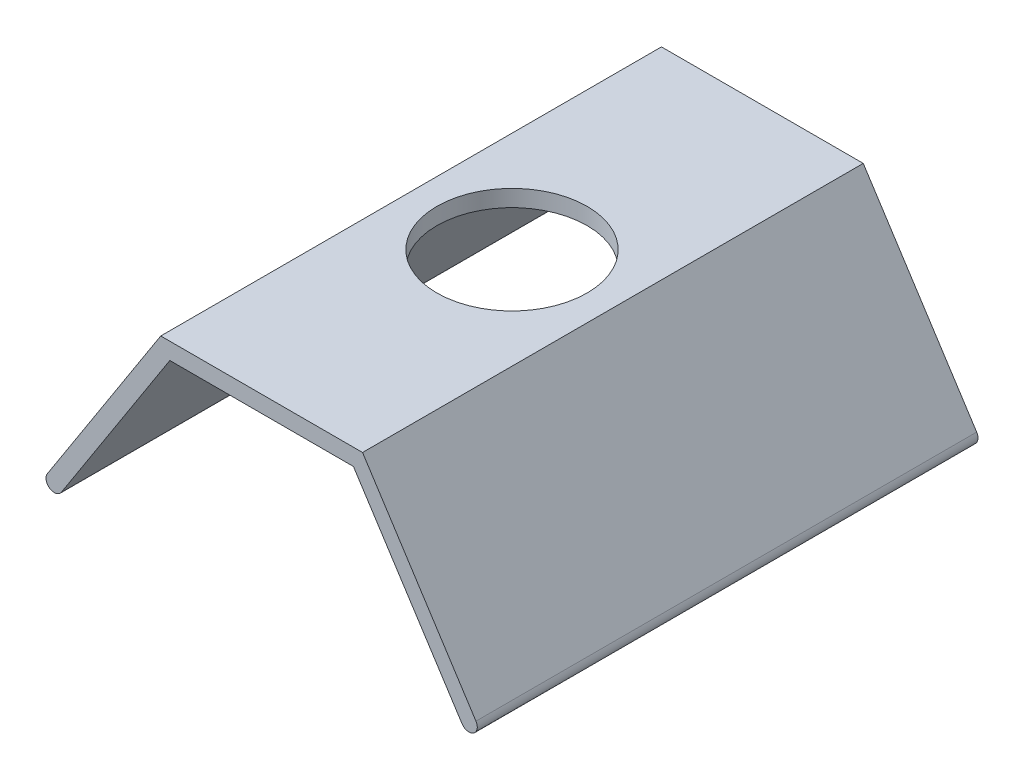
ISO-10303-21;
HEADER;
FILE_DESCRIPTION(('STEP AP214'),'2;1');
FILE_NAME('part.step','',(''),(''),'','','');
FILE_SCHEMA(('AUTOMOTIVE_DESIGN { 1 0 10303 214 1 1 1 1 }'));
ENDSEC;
DATA;
#1=APPLICATION_CONTEXT('core data for automotive mechanical design processes');
#2=APPLICATION_PROTOCOL_DEFINITION('international standard','automotive_design',2000,#1);
#3=PRODUCT_CONTEXT('',#1,'mechanical');
#4=PRODUCT('Part','Part','',(#3));
#5=PRODUCT_RELATED_PRODUCT_CATEGORY('part','',(#4));
#6=PRODUCT_DEFINITION_FORMATION('','',#4);
#7=PRODUCT_DEFINITION_CONTEXT('part definition',#1,'design');
#8=PRODUCT_DEFINITION('design','',#6,#7);
#9=PRODUCT_DEFINITION_SHAPE('','',#8);
#10=(LENGTH_UNIT() NAMED_UNIT(*) SI_UNIT(.MILLI.,.METRE.));
#11=(NAMED_UNIT(*) PLANE_ANGLE_UNIT() SI_UNIT($,.RADIAN.));
#12=(NAMED_UNIT(*) SI_UNIT($,.STERADIAN.) SOLID_ANGLE_UNIT());
#13=UNCERTAINTY_MEASURE_WITH_UNIT(LENGTH_MEASURE(1.E-05),#10,'distance_accuracy_value','');
#14=(GEOMETRIC_REPRESENTATION_CONTEXT(3) GLOBAL_UNCERTAINTY_ASSIGNED_CONTEXT((#13)) GLOBAL_UNIT_ASSIGNED_CONTEXT((#10,
#11,#12)) REPRESENTATION_CONTEXT('',''));
#15=CARTESIAN_POINT('',(0.,0.,0.));
#16=DIRECTION('',(0.,0.,1.));
#17=DIRECTION('',(1.,0.,0.));
#18=AXIS2_PLACEMENT_3D('',#15,#16,#17);
#19=CARTESIAN_POINT('',(-3.02262487840314,0.5,7.5));
#20=DIRECTION('',(0.,-1.,0.));
#21=DIRECTION('',(0.,0.,-1.));
#22=AXIS2_PLACEMENT_3D('',#19,#20,#21);
#23=PLANE('',#22);
#24=CARTESIAN_POINT('',(0.,0.500000000000001,0.));
#25=DIRECTION('',(0.,1.,0.));
#26=DIRECTION('',(0.,0.,1.));
#27=AXIS2_PLACEMENT_3D('',#24,#25,#26);
#28=CIRCLE('',#27,2.24999999999999);
#29=CARTESIAN_POINT('',(0.,0.500000000000001,2.24999999999999));
#30=VERTEX_POINT('',#29);
#31=EDGE_CURVE('E184',#30,#30,#28,.T.);
#32=ORIENTED_EDGE('',*,*,#31,.F.);
#33=EDGE_LOOP('',(#32));
#34=FACE_BOUND('',#33,.T.);
#35=DIRECTION('',(-1.,0.,0.));
#36=VECTOR('',#35,1.);
#37=CARTESIAN_POINT('',(-3.02262487840314,0.5,-7.5));
#38=LINE('',#37,#36);
#39=CARTESIAN_POINT('',(3.02262487840314,0.5,-7.5));
#40=VERTEX_POINT('',#39);
#41=CARTESIAN_POINT('',(-3.02262487840314,0.5,-7.5));
#42=VERTEX_POINT('',#41);
#43=EDGE_CURVE('E136',#40,#42,#38,.T.);
#44=ORIENTED_EDGE('',*,*,#43,.T.);
#45=DIRECTION('',(0.,0.,-1.));
#46=VECTOR('',#45,1.);
#47=CARTESIAN_POINT('',(-3.02262487840314,0.5,7.5));
#48=LINE('',#47,#46);
#49=CARTESIAN_POINT('',(-3.02262487840314,0.5,7.5));
#50=VERTEX_POINT('',#49);
#51=EDGE_CURVE('E11',#50,#42,#48,.T.);
#52=ORIENTED_EDGE('',*,*,#51,.F.);
#53=DIRECTION('',(-1.,0.,0.));
#54=VECTOR('',#53,1.);
#55=CARTESIAN_POINT('',(-3.02262487840314,0.5,7.5));
#56=LINE('',#55,#54);
#57=CARTESIAN_POINT('',(3.02262487840314,0.5,7.5));
#58=VERTEX_POINT('',#57);
#59=EDGE_CURVE('E150',#58,#50,#56,.T.);
#60=ORIENTED_EDGE('',*,*,#59,.F.);
#61=DIRECTION('',(0.,0.,-1.));
#62=VECTOR('',#61,1.);
#63=CARTESIAN_POINT('',(3.02262487840314,0.5,7.5));
#64=LINE('',#63,#62);
#65=EDGE_CURVE('E132',#58,#40,#64,.T.);
#66=ORIENTED_EDGE('',*,*,#65,.T.);
#67=EDGE_LOOP('',(#44,#52,#60,#66));
#68=FACE_BOUND('',#67,.T.);
#69=ADVANCED_FACE('F39',(#34,#68),#23,.F.);
#70=CARTESIAN_POINT('',(-3.02262487840314,0.5,7.5));
#71=DIRECTION('',(0.840593375076334,-0.541666666666666,0.));
#72=DIRECTION('',(0.541666666666666,0.840593375076334,0.));
#73=AXIS2_PLACEMENT_3D('',#70,#71,#72);
#74=PLANE('',#73);
#75=DIRECTION('',(-0.541666666666666,-0.840593375076334,0.));
#76=VECTOR('',#75,1.);
#77=CARTESIAN_POINT('',(-3.02262487840314,0.5,-7.5));
#78=LINE('',#77,#76);
#79=CARTESIAN_POINT('',(-6.42029668753817,-4.77272691712467,-7.5));
#80=VERTEX_POINT('',#79);
#81=EDGE_CURVE('E139',#42,#80,#78,.T.);
#82=ORIENTED_EDGE('',*,*,#81,.T.);
#83=DIRECTION('',(0.,0.,-1.));
#84=VECTOR('',#83,1.);
#85=CARTESIAN_POINT('',(-6.42029668753817,-4.77272691712467,7.5));
#86=LINE('',#85,#84);
#87=CARTESIAN_POINT('',(-6.42029668753817,-4.77272691712467,7.5));
#88=VERTEX_POINT('',#87);
#89=EDGE_CURVE('E48',#88,#80,#86,.T.);
#90=ORIENTED_EDGE('',*,*,#89,.F.);
#91=DIRECTION('',(-0.541666666666666,-0.840593375076334,0.));
#92=VECTOR('',#91,1.);
#93=CARTESIAN_POINT('',(-3.02262487840314,0.5,7.5));
#94=LINE('',#93,#92);
#95=EDGE_CURVE('E99',#50,#88,#94,.T.);
#96=ORIENTED_EDGE('',*,*,#95,.F.);
#97=ORIENTED_EDGE('',*,*,#51,.T.);
#98=EDGE_LOOP('',(#82,#90,#96,#97));
#99=FACE_BOUND('',#98,.T.);
#100=ADVANCED_FACE('F202',(#99),#74,.F.);
#101=CARTESIAN_POINT('',(-6.21014834376908,-4.90814358379134,7.5));
#102=DIRECTION('',(0.,0.,-1.));
#103=DIRECTION('',(-1.,0.,0.));
#104=AXIS2_PLACEMENT_3D('',#101,#102,#103);
#105=CYLINDRICAL_SURFACE('',#104,0.25);
#106=CARTESIAN_POINT('',(-6.21014834376908,-4.90814358379134,-7.5));
#107=DIRECTION('',(0.,0.,1.));
#108=DIRECTION('',(-1.,0.,0.));
#109=AXIS2_PLACEMENT_3D('',#106,#107,#108);
#110=CIRCLE('',#109,0.25);
#111=CARTESIAN_POINT('',(-6.,-5.043560250458,-7.5));
#112=VERTEX_POINT('',#111);
#113=EDGE_CURVE('E141',#80,#112,#110,.T.);
#114=ORIENTED_EDGE('',*,*,#113,.T.);
#115=DIRECTION('',(0.,0.,-1.));
#116=VECTOR('',#115,1.);
#117=CARTESIAN_POINT('',(-6.,-5.043560250458,7.5));
#118=LINE('',#117,#116);
#119=CARTESIAN_POINT('',(-6.,-5.043560250458,7.5));
#120=VERTEX_POINT('',#119);
#121=EDGE_CURVE('E157',#120,#112,#118,.T.);
#122=ORIENTED_EDGE('',*,*,#121,.F.);
#123=CARTESIAN_POINT('',(-6.21014834376908,-4.90814358379134,7.5));
#124=DIRECTION('',(0.,0.,1.));
#125=DIRECTION('',(-1.,0.,0.));
#126=AXIS2_PLACEMENT_3D('',#123,#124,#125);
#127=CIRCLE('',#126,0.25);
#128=EDGE_CURVE('E166',#88,#120,#127,.T.);
#129=ORIENTED_EDGE('',*,*,#128,.F.);
#130=ORIENTED_EDGE('',*,*,#89,.T.);
#131=EDGE_LOOP('',(#114,#122,#129,#130));
#132=FACE_BOUND('',#131,.T.);
#133=ADVANCED_FACE('F164',(#132),#105,.T.);
#134=CARTESIAN_POINT('',(-2.75,0.,7.5));
#135=DIRECTION('',(-0.840593375076334,0.541666666666667,0.));
#136=DIRECTION('',(-0.541666666666667,-0.840593375076334,0.));
#137=AXIS2_PLACEMENT_3D('',#134,#135,#136);
#138=PLANE('',#137);
#139=DIRECTION('',(0.541666666666666,0.840593375076334,0.));
#140=VECTOR('',#139,1.);
#141=CARTESIAN_POINT('',(-2.75,0.,-7.5));
#142=LINE('',#141,#140);
#143=CARTESIAN_POINT('',(-2.75,0.,-7.5));
#144=VERTEX_POINT('',#143);
#145=EDGE_CURVE('E143',#112,#144,#142,.T.);
#146=ORIENTED_EDGE('',*,*,#145,.T.);
#147=DIRECTION('',(0.,0.,-1.));
#148=VECTOR('',#147,1.);
#149=CARTESIAN_POINT('',(-2.75,0.,7.5));
#150=LINE('',#149,#148);
#151=CARTESIAN_POINT('',(-2.75,0.,7.5));
#152=VERTEX_POINT('',#151);
#153=EDGE_CURVE('E154',#152,#144,#150,.T.);
#154=ORIENTED_EDGE('',*,*,#153,.F.);
#155=DIRECTION('',(0.541666666666666,0.840593375076334,0.));
#156=VECTOR('',#155,1.);
#157=CARTESIAN_POINT('',(-2.75,0.,7.5));
#158=LINE('',#157,#156);
#159=EDGE_CURVE('E178',#120,#152,#158,.T.);
#160=ORIENTED_EDGE('',*,*,#159,.F.);
#161=ORIENTED_EDGE('',*,*,#121,.T.);
#162=EDGE_LOOP('',(#146,#154,#160,#161));
#163=FACE_BOUND('',#162,.T.);
#164=ADVANCED_FACE('F174',(#163),#138,.F.);
#165=CARTESIAN_POINT('',(-2.75,0.,7.5));
#166=DIRECTION('',(0.,1.,0.));
#167=DIRECTION('',(-1.,0.,0.));
#168=AXIS2_PLACEMENT_3D('',#165,#166,#167);
#169=PLANE('',#168);
#170=CARTESIAN_POINT('',(0.,0.,0.));
#171=DIRECTION('',(0.,1.,0.));
#172=DIRECTION('',(-1.,0.,0.));
#173=AXIS2_PLACEMENT_3D('',#170,#171,#172);
#174=CIRCLE('',#173,2.24999999999999);
#175=CARTESIAN_POINT('',(-2.24999999999999,0.,0.));
#176=VERTEX_POINT('',#175);
#177=EDGE_CURVE('E42',#176,#176,#174,.T.);
#178=ORIENTED_EDGE('',*,*,#177,.T.);
#179=EDGE_LOOP('',(#178));
#180=FACE_BOUND('',#179,.T.);
#181=DIRECTION('',(1.,0.,0.));
#182=VECTOR('',#181,1.);
#183=CARTESIAN_POINT('',(-2.75,0.,-7.5));
#184=LINE('',#183,#182);
#185=CARTESIAN_POINT('',(2.75,0.,-7.5));
#186=VERTEX_POINT('',#185);
#187=EDGE_CURVE('E145',#144,#186,#184,.T.);
#188=ORIENTED_EDGE('',*,*,#187,.T.);
#189=DIRECTION('',(0.,0.,-1.));
#190=VECTOR('',#189,1.);
#191=CARTESIAN_POINT('',(2.75,0.,7.5));
#192=LINE('',#191,#190);
#193=CARTESIAN_POINT('',(2.75,0.,7.5));
#194=VERTEX_POINT('',#193);
#195=EDGE_CURVE('E127',#194,#186,#192,.T.);
#196=ORIENTED_EDGE('',*,*,#195,.F.);
#197=DIRECTION('',(1.,0.,0.));
#198=VECTOR('',#197,1.);
#199=CARTESIAN_POINT('',(-2.75,0.,7.5));
#200=LINE('',#199,#198);
#201=EDGE_CURVE('E118',#152,#194,#200,.T.);
#202=ORIENTED_EDGE('',*,*,#201,.F.);
#203=ORIENTED_EDGE('',*,*,#153,.T.);
#204=EDGE_LOOP('',(#188,#196,#202,#203));
#205=FACE_BOUND('',#204,.T.);
#206=ADVANCED_FACE('F177',(#180,#205),#169,.F.);
#207=CARTESIAN_POINT('',(2.75,0.,7.5));
#208=DIRECTION('',(0.840593375076334,0.541666666666667,0.));
#209=DIRECTION('',(-0.541666666666667,0.840593375076334,0.));
#210=AXIS2_PLACEMENT_3D('',#207,#208,#209);
#211=PLANE('',#210);
#212=DIRECTION('',(0.541666666666667,-0.840593375076334,0.));
#213=VECTOR('',#212,1.);
#214=CARTESIAN_POINT('',(2.75,0.,-7.5));
#215=LINE('',#214,#213);
#216=CARTESIAN_POINT('',(6.,-5.043560250458,-7.5));
#217=VERTEX_POINT('',#216);
#218=EDGE_CURVE('E126',#186,#217,#215,.T.);
#219=ORIENTED_EDGE('',*,*,#218,.T.);
#220=DIRECTION('',(0.,0.,-1.));
#221=VECTOR('',#220,1.);
#222=CARTESIAN_POINT('',(6.,-5.043560250458,7.5));
#223=LINE('',#222,#221);
#224=CARTESIAN_POINT('',(6.,-5.043560250458,7.5));
#225=VERTEX_POINT('',#224);
#226=EDGE_CURVE('E123',#225,#217,#223,.T.);
#227=ORIENTED_EDGE('',*,*,#226,.F.);
#228=DIRECTION('',(0.541666666666667,-0.840593375076334,0.));
#229=VECTOR('',#228,1.);
#230=CARTESIAN_POINT('',(2.75,0.,7.5));
#231=LINE('',#230,#229);
#232=EDGE_CURVE('E112',#194,#225,#231,.T.);
#233=ORIENTED_EDGE('',*,*,#232,.F.);
#234=ORIENTED_EDGE('',*,*,#195,.T.);
#235=EDGE_LOOP('',(#219,#227,#233,#234));
#236=FACE_BOUND('',#235,.T.);
#237=ADVANCED_FACE('F124',(#236),#211,.F.);
#238=CARTESIAN_POINT('',(6.21014834376908,-4.90814358379134,7.5));
#239=DIRECTION('',(0.,0.,-1.));
#240=DIRECTION('',(-1.,0.,0.));
#241=AXIS2_PLACEMENT_3D('',#238,#239,#240);
#242=CYLINDRICAL_SURFACE('',#241,0.249999999999999);
#243=CARTESIAN_POINT('',(6.21014834376908,-4.90814358379134,-7.5));
#244=DIRECTION('',(0.,0.,1.));
#245=DIRECTION('',(1.,0.,0.));
#246=AXIS2_PLACEMENT_3D('',#243,#244,#245);
#247=CIRCLE('',#246,0.249999999999999);
#248=CARTESIAN_POINT('',(6.42029668753817,-4.77272691712467,-7.5));
#249=VERTEX_POINT('',#248);
#250=EDGE_CURVE('E85',#217,#249,#247,.T.);
#251=ORIENTED_EDGE('',*,*,#250,.T.);
#252=DIRECTION('',(0.,0.,-1.));
#253=VECTOR('',#252,1.);
#254=CARTESIAN_POINT('',(6.42029668753817,-4.77272691712467,7.5));
#255=LINE('',#254,#253);
#256=CARTESIAN_POINT('',(6.42029668753817,-4.77272691712467,7.5));
#257=VERTEX_POINT('',#256);
#258=EDGE_CURVE('E128',#257,#249,#255,.T.);
#259=ORIENTED_EDGE('',*,*,#258,.F.);
#260=CARTESIAN_POINT('',(6.21014834376908,-4.90814358379134,7.5));
#261=DIRECTION('',(0.,0.,1.));
#262=DIRECTION('',(1.,0.,0.));
#263=AXIS2_PLACEMENT_3D('',#260,#261,#262);
#264=CIRCLE('',#263,0.249999999999999);
#265=EDGE_CURVE('E116',#225,#257,#264,.T.);
#266=ORIENTED_EDGE('',*,*,#265,.F.);
#267=ORIENTED_EDGE('',*,*,#226,.T.);
#268=EDGE_LOOP('',(#251,#259,#266,#267));
#269=FACE_BOUND('',#268,.T.);
#270=ADVANCED_FACE('F130',(#269),#242,.T.);
#271=CARTESIAN_POINT('',(3.02262487840314,0.5,7.5));
#272=DIRECTION('',(-0.840593375076334,-0.541666666666667,0.));
#273=DIRECTION('',(0.541666666666667,-0.840593375076334,0.));
#274=AXIS2_PLACEMENT_3D('',#271,#272,#273);
#275=PLANE('',#274);
#276=DIRECTION('',(-0.541666666666667,0.840593375076334,0.));
#277=VECTOR('',#276,1.);
#278=CARTESIAN_POINT('',(3.02262487840314,0.5,-7.5));
#279=LINE('',#278,#277);
#280=EDGE_CURVE('E91',#249,#40,#279,.T.);
#281=ORIENTED_EDGE('',*,*,#280,.T.);
#282=ORIENTED_EDGE('',*,*,#65,.F.);
#283=DIRECTION('',(-0.541666666666667,0.840593375076334,0.));
#284=VECTOR('',#283,1.);
#285=CARTESIAN_POINT('',(3.02262487840314,0.5,7.5));
#286=LINE('',#285,#284);
#287=EDGE_CURVE('E56',#257,#58,#286,.T.);
#288=ORIENTED_EDGE('',*,*,#287,.F.);
#289=ORIENTED_EDGE('',*,*,#258,.T.);
#290=EDGE_LOOP('',(#281,#282,#288,#289));
#291=FACE_BOUND('',#290,.T.);
#292=ADVANCED_FACE('F210',(#291),#275,.F.);
#293=CARTESIAN_POINT('',(6.21014834376908,-4.90814358379134,7.5));
#294=DIRECTION('',(0.,0.,1.));
#295=DIRECTION('',(1.,0.,0.));
#296=AXIS2_PLACEMENT_3D('',#293,#294,#295);
#297=PLANE('',#296);
#298=ORIENTED_EDGE('',*,*,#59,.T.);
#299=ORIENTED_EDGE('',*,*,#95,.T.);
#300=ORIENTED_EDGE('',*,*,#128,.T.);
#301=ORIENTED_EDGE('',*,*,#159,.T.);
#302=ORIENTED_EDGE('',*,*,#201,.T.);
#303=ORIENTED_EDGE('',*,*,#232,.T.);
#304=ORIENTED_EDGE('',*,*,#265,.T.);
#305=ORIENTED_EDGE('',*,*,#287,.T.);
#306=EDGE_LOOP('',(#298,#299,#300,#301,#302,#303,#304,#305));
#307=FACE_BOUND('',#306,.T.);
#308=ADVANCED_FACE('F114',(#307),#297,.T.);
#309=CARTESIAN_POINT('',(6.21014834376908,-4.90814358379134,-7.5));
#310=DIRECTION('',(0.,0.,1.));
#311=DIRECTION('',(1.,0.,0.));
#312=AXIS2_PLACEMENT_3D('',#309,#310,#311);
#313=PLANE('',#312);
#314=ORIENTED_EDGE('',*,*,#43,.F.);
#315=ORIENTED_EDGE('',*,*,#280,.F.);
#316=ORIENTED_EDGE('',*,*,#250,.F.);
#317=ORIENTED_EDGE('',*,*,#218,.F.);
#318=ORIENTED_EDGE('',*,*,#187,.F.);
#319=ORIENTED_EDGE('',*,*,#145,.F.);
#320=ORIENTED_EDGE('',*,*,#113,.F.);
#321=ORIENTED_EDGE('',*,*,#81,.F.);
#322=EDGE_LOOP('',(#314,#315,#316,#317,#318,#319,#320,#321));
#323=FACE_BOUND('',#322,.T.);
#324=ADVANCED_FACE('F170',(#323),#313,.F.);
#325=CARTESIAN_POINT('',(0.,0.5,0.));
#326=DIRECTION('',(0.,1.,0.));
#327=DIRECTION('',(0.,0.,1.));
#328=AXIS2_PLACEMENT_3D('',#325,#326,#327);
#329=CYLINDRICAL_SURFACE('',#328,2.24999999999999);
#330=ORIENTED_EDGE('',*,*,#31,.T.);
#331=EDGE_LOOP('',(#330));
#332=FACE_BOUND('',#331,.T.);
#333=ORIENTED_EDGE('',*,*,#177,.F.);
#334=EDGE_LOOP('',(#333));
#335=FACE_BOUND('',#334,.T.);
#336=ADVANCED_FACE('F192',(#332,#335),#329,.F.);
#337=CLOSED_SHELL('',(#69,#100,#133,#164,#206,#237,#270,#292,#308,#324,#336));
#338=MANIFOLD_SOLID_BREP('B2',#337);
#339=ADVANCED_BREP_SHAPE_REPRESENTATION('',(#18,#338),#14);
#340=SHAPE_DEFINITION_REPRESENTATION(#9,#339);
ENDSEC;
END-ISO-10303-21;
